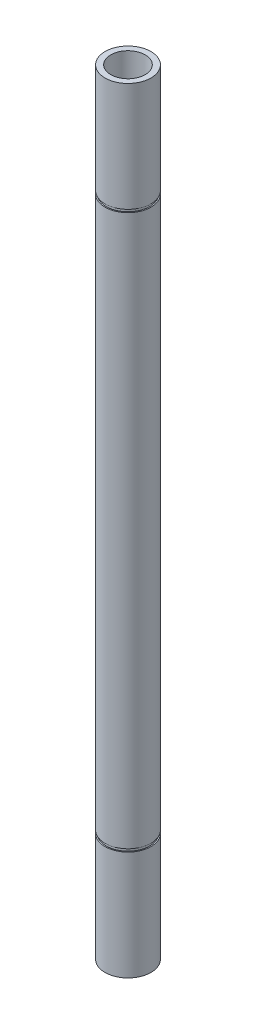
ISO-10303-21;
HEADER;
FILE_DESCRIPTION(('STEP AP214'),'2;1');
FILE_NAME('part.step','',(''),(''),'','','');
FILE_SCHEMA(('AUTOMOTIVE_DESIGN { 1 0 10303 214 1 1 1 1 }'));
ENDSEC;
DATA;
#1=APPLICATION_CONTEXT('core data for automotive mechanical design processes');
#2=APPLICATION_PROTOCOL_DEFINITION('international standard','automotive_design',2000,#1);
#3=PRODUCT_CONTEXT('',#1,'mechanical');
#4=PRODUCT('Part','Part','',(#3));
#5=PRODUCT_RELATED_PRODUCT_CATEGORY('part','',(#4));
#6=PRODUCT_DEFINITION_FORMATION('','',#4);
#7=PRODUCT_DEFINITION_CONTEXT('part definition',#1,'design');
#8=PRODUCT_DEFINITION('design','',#6,#7);
#9=PRODUCT_DEFINITION_SHAPE('','',#8);
#10=(LENGTH_UNIT() NAMED_UNIT(*) SI_UNIT(.MILLI.,.METRE.));
#11=(NAMED_UNIT(*) PLANE_ANGLE_UNIT() SI_UNIT($,.RADIAN.));
#12=(NAMED_UNIT(*) SI_UNIT($,.STERADIAN.) SOLID_ANGLE_UNIT());
#13=UNCERTAINTY_MEASURE_WITH_UNIT(LENGTH_MEASURE(1.E-05),#10,'distance_accuracy_value','');
#14=(GEOMETRIC_REPRESENTATION_CONTEXT(3) GLOBAL_UNCERTAINTY_ASSIGNED_CONTEXT((#13)) GLOBAL_UNIT_ASSIGNED_CONTEXT((#10,
#11,#12)) REPRESENTATION_CONTEXT('',''));
#15=CARTESIAN_POINT('',(0.,0.,0.));
#16=DIRECTION('',(0.,0.,1.));
#17=DIRECTION('',(1.,0.,0.));
#18=AXIS2_PLACEMENT_3D('',#15,#16,#17);
#19=CARTESIAN_POINT('',(0.,64.3022671838045,0.));
#20=DIRECTION('',(0.,1.,0.));
#21=DIRECTION('',(0.,0.,1.));
#22=AXIS2_PLACEMENT_3D('',#19,#20,#21);
#23=CYLINDRICAL_SURFACE('',#22,3.);
#24=CARTESIAN_POINT('',(0.,67.5,0.));
#25=DIRECTION('',(0.,1.,0.));
#26=DIRECTION('',(0.,0.,1.));
#27=AXIS2_PLACEMENT_3D('',#24,#25,#26);
#28=CIRCLE('',#27,3.);
#29=CARTESIAN_POINT('',(0.,67.5,3.));
#30=VERTEX_POINT('',#29);
#31=EDGE_CURVE('E94',#30,#30,#28,.T.);
#32=ORIENTED_EDGE('',*,*,#31,.T.);
#33=EDGE_LOOP('',(#32));
#34=FACE_BOUND('',#33,.T.);
#35=CARTESIAN_POINT('',(0.,-67.5,0.));
#36=DIRECTION('',(0.,1.,0.));
#37=DIRECTION('',(0.,0.,1.));
#38=AXIS2_PLACEMENT_3D('',#35,#36,#37);
#39=CIRCLE('',#38,3.);
#40=CARTESIAN_POINT('',(0.,-67.5,3.));
#41=VERTEX_POINT('',#40);
#42=EDGE_CURVE('E10',#41,#41,#39,.T.);
#43=ORIENTED_EDGE('',*,*,#42,.F.);
#44=EDGE_LOOP('',(#43));
#45=FACE_BOUND('',#44,.T.);
#46=ADVANCED_FACE('F43',(#34,#45),#23,.F.);
#47=CARTESIAN_POINT('',(-3.,-67.5,0.));
#48=DIRECTION('',(0.,-1.,0.));
#49=DIRECTION('',(0.,0.,-1.));
#50=AXIS2_PLACEMENT_3D('',#47,#48,#49);
#51=PLANE('',#50);
#52=ORIENTED_EDGE('',*,*,#42,.T.);
#53=EDGE_LOOP('',(#52));
#54=FACE_BOUND('',#53,.T.);
#55=CARTESIAN_POINT('',(0.,-67.5,0.));
#56=DIRECTION('',(0.,1.,0.));
#57=DIRECTION('',(0.,0.,1.));
#58=AXIS2_PLACEMENT_3D('',#55,#56,#57);
#59=CIRCLE('',#58,4.);
#60=CARTESIAN_POINT('',(0.,-67.5,4.));
#61=VERTEX_POINT('',#60);
#62=EDGE_CURVE('E49',#61,#61,#59,.T.);
#63=ORIENTED_EDGE('',*,*,#62,.F.);
#64=EDGE_LOOP('',(#63));
#65=FACE_BOUND('',#64,.T.);
#66=ADVANCED_FACE('F114',(#54,#65),#51,.T.);
#67=CARTESIAN_POINT('',(0.,64.3022671838045,0.));
#68=DIRECTION('',(0.,1.,0.));
#69=DIRECTION('',(0.,0.,1.));
#70=AXIS2_PLACEMENT_3D('',#67,#68,#69);
#71=CYLINDRICAL_SURFACE('',#70,4.);
#72=ORIENTED_EDGE('',*,*,#62,.T.);
#73=EDGE_LOOP('',(#72));
#74=FACE_BOUND('',#73,.T.);
#75=CARTESIAN_POINT('',(0.,-48.5,0.));
#76=DIRECTION('',(0.,1.,0.));
#77=DIRECTION('',(0.,0.,1.));
#78=AXIS2_PLACEMENT_3D('',#75,#76,#77);
#79=CIRCLE('',#78,4.);
#80=CARTESIAN_POINT('',(0.,-48.5,4.));
#81=VERTEX_POINT('',#80);
#82=EDGE_CURVE('E54',#81,#81,#79,.T.);
#83=ORIENTED_EDGE('',*,*,#82,.F.);
#84=EDGE_LOOP('',(#83));
#85=FACE_BOUND('',#84,.T.);
#86=ADVANCED_FACE('F116',(#74,#85),#71,.T.);
#87=CARTESIAN_POINT('',(-4.,-48.5,0.));
#88=DIRECTION('',(0.,1.,0.));
#89=DIRECTION('',(0.,0.,1.));
#90=AXIS2_PLACEMENT_3D('',#87,#88,#89);
#91=PLANE('',#90);
#92=ORIENTED_EDGE('',*,*,#82,.T.);
#93=EDGE_LOOP('',(#92));
#94=FACE_BOUND('',#93,.T.);
#95=CARTESIAN_POINT('',(0.,-48.5,0.));
#96=DIRECTION('',(0.,1.,0.));
#97=DIRECTION('',(0.,0.,1.));
#98=AXIS2_PLACEMENT_3D('',#95,#96,#97);
#99=CIRCLE('',#98,3.8);
#100=CARTESIAN_POINT('',(0.,-48.5,3.8));
#101=VERTEX_POINT('',#100);
#102=EDGE_CURVE('E58',#101,#101,#99,.T.);
#103=ORIENTED_EDGE('',*,*,#102,.F.);
#104=EDGE_LOOP('',(#103));
#105=FACE_BOUND('',#104,.T.);
#106=ADVANCED_FACE('F121',(#94,#105),#91,.T.);
#107=CARTESIAN_POINT('',(0.,64.3022671838045,0.));
#108=DIRECTION('',(0.,1.,0.));
#109=DIRECTION('',(0.,0.,1.));
#110=AXIS2_PLACEMENT_3D('',#107,#108,#109);
#111=CYLINDRICAL_SURFACE('',#110,3.8);
#112=ORIENTED_EDGE('',*,*,#102,.T.);
#113=EDGE_LOOP('',(#112));
#114=FACE_BOUND('',#113,.T.);
#115=CARTESIAN_POINT('',(0.,-48.,0.));
#116=DIRECTION('',(0.,1.,0.));
#117=DIRECTION('',(0.,0.,1.));
#118=AXIS2_PLACEMENT_3D('',#115,#116,#117);
#119=CIRCLE('',#118,3.8);
#120=CARTESIAN_POINT('',(0.,-48.,3.8));
#121=VERTEX_POINT('',#120);
#122=EDGE_CURVE('E66',#121,#121,#119,.T.);
#123=ORIENTED_EDGE('',*,*,#122,.F.);
#124=EDGE_LOOP('',(#123));
#125=FACE_BOUND('',#124,.T.);
#126=ADVANCED_FACE('F130',(#114,#125),#111,.T.);
#127=CARTESIAN_POINT('',(-3.8,-48.,0.));
#128=DIRECTION('',(0.,-1.,0.));
#129=DIRECTION('',(0.,0.,-1.));
#130=AXIS2_PLACEMENT_3D('',#127,#128,#129);
#131=PLANE('',#130);
#132=ORIENTED_EDGE('',*,*,#122,.T.);
#133=EDGE_LOOP('',(#132));
#134=FACE_BOUND('',#133,.T.);
#135=CARTESIAN_POINT('',(0.,-48.,0.));
#136=DIRECTION('',(0.,1.,0.));
#137=DIRECTION('',(0.,0.,1.));
#138=AXIS2_PLACEMENT_3D('',#135,#136,#137);
#139=CIRCLE('',#138,3.99999999999998);
#140=CARTESIAN_POINT('',(0.,-48.,3.99999999999998));
#141=VERTEX_POINT('',#140);
#142=EDGE_CURVE('E69',#141,#141,#139,.T.);
#143=ORIENTED_EDGE('',*,*,#142,.F.);
#144=EDGE_LOOP('',(#143));
#145=FACE_BOUND('',#144,.T.);
#146=ADVANCED_FACE('F134',(#134,#145),#131,.T.);
#147=CARTESIAN_POINT('',(0.,64.3022671838045,0.));
#148=DIRECTION('',(0.,1.,0.));
#149=DIRECTION('',(0.,0.,1.));
#150=AXIS2_PLACEMENT_3D('',#147,#148,#149);
#151=CYLINDRICAL_SURFACE('',#150,3.99999999999998);
#152=ORIENTED_EDGE('',*,*,#142,.T.);
#153=EDGE_LOOP('',(#152));
#154=FACE_BOUND('',#153,.T.);
#155=CARTESIAN_POINT('',(0.,48.,0.));
#156=DIRECTION('',(0.,1.,0.));
#157=DIRECTION('',(0.,0.,1.));
#158=AXIS2_PLACEMENT_3D('',#155,#156,#157);
#159=CIRCLE('',#158,3.99999999999998);
#160=CARTESIAN_POINT('',(0.,48.,3.99999999999998));
#161=VERTEX_POINT('',#160);
#162=EDGE_CURVE('E74',#161,#161,#159,.T.);
#163=ORIENTED_EDGE('',*,*,#162,.F.);
#164=EDGE_LOOP('',(#163));
#165=FACE_BOUND('',#164,.T.);
#166=ADVANCED_FACE('F132',(#154,#165),#151,.T.);
#167=CARTESIAN_POINT('',(-3.8,48.,0.));
#168=DIRECTION('',(0.,1.,0.));
#169=DIRECTION('',(0.,0.,1.));
#170=AXIS2_PLACEMENT_3D('',#167,#168,#169);
#171=PLANE('',#170);
#172=ORIENTED_EDGE('',*,*,#162,.T.);
#173=EDGE_LOOP('',(#172));
#174=FACE_BOUND('',#173,.T.);
#175=CARTESIAN_POINT('',(0.,48.,0.));
#176=DIRECTION('',(0.,1.,0.));
#177=DIRECTION('',(0.,0.,1.));
#178=AXIS2_PLACEMENT_3D('',#175,#176,#177);
#179=CIRCLE('',#178,3.8);
#180=CARTESIAN_POINT('',(0.,48.,3.8));
#181=VERTEX_POINT('',#180);
#182=EDGE_CURVE('E80',#181,#181,#179,.T.);
#183=ORIENTED_EDGE('',*,*,#182,.F.);
#184=EDGE_LOOP('',(#183));
#185=FACE_BOUND('',#184,.T.);
#186=ADVANCED_FACE('F138',(#174,#185),#171,.T.);
#187=CARTESIAN_POINT('',(0.,64.3022671838045,0.));
#188=DIRECTION('',(0.,1.,0.));
#189=DIRECTION('',(0.,0.,1.));
#190=AXIS2_PLACEMENT_3D('',#187,#188,#189);
#191=CYLINDRICAL_SURFACE('',#190,3.8);
#192=ORIENTED_EDGE('',*,*,#182,.T.);
#193=EDGE_LOOP('',(#192));
#194=FACE_BOUND('',#193,.T.);
#195=CARTESIAN_POINT('',(0.,48.5,0.));
#196=DIRECTION('',(0.,1.,0.));
#197=DIRECTION('',(0.,0.,1.));
#198=AXIS2_PLACEMENT_3D('',#195,#196,#197);
#199=CIRCLE('',#198,3.8);
#200=CARTESIAN_POINT('',(0.,48.5,3.8));
#201=VERTEX_POINT('',#200);
#202=EDGE_CURVE('E85',#201,#201,#199,.T.);
#203=ORIENTED_EDGE('',*,*,#202,.F.);
#204=EDGE_LOOP('',(#203));
#205=FACE_BOUND('',#204,.T.);
#206=ADVANCED_FACE('F141',(#194,#205),#191,.T.);
#207=CARTESIAN_POINT('',(-4.,48.5,0.));
#208=DIRECTION('',(0.,-1.,0.));
#209=DIRECTION('',(0.,0.,-1.));
#210=AXIS2_PLACEMENT_3D('',#207,#208,#209);
#211=PLANE('',#210);
#212=ORIENTED_EDGE('',*,*,#202,.T.);
#213=EDGE_LOOP('',(#212));
#214=FACE_BOUND('',#213,.T.);
#215=CARTESIAN_POINT('',(0.,48.5,0.));
#216=DIRECTION('',(0.,1.,0.));
#217=DIRECTION('',(0.,0.,1.));
#218=AXIS2_PLACEMENT_3D('',#215,#216,#217);
#219=CIRCLE('',#218,4.);
#220=CARTESIAN_POINT('',(0.,48.5,4.));
#221=VERTEX_POINT('',#220);
#222=EDGE_CURVE('E88',#221,#221,#219,.T.);
#223=ORIENTED_EDGE('',*,*,#222,.F.);
#224=EDGE_LOOP('',(#223));
#225=FACE_BOUND('',#224,.T.);
#226=ADVANCED_FACE('F108',(#214,#225),#211,.T.);
#227=CARTESIAN_POINT('',(0.,64.3022671838045,0.));
#228=DIRECTION('',(0.,1.,0.));
#229=DIRECTION('',(0.,0.,1.));
#230=AXIS2_PLACEMENT_3D('',#227,#228,#229);
#231=CYLINDRICAL_SURFACE('',#230,4.);
#232=ORIENTED_EDGE('',*,*,#222,.T.);
#233=EDGE_LOOP('',(#232));
#234=FACE_BOUND('',#233,.T.);
#235=CARTESIAN_POINT('',(0.,67.5,0.));
#236=DIRECTION('',(0.,1.,0.));
#237=DIRECTION('',(0.,0.,1.));
#238=AXIS2_PLACEMENT_3D('',#235,#236,#237);
#239=CIRCLE('',#238,4.);
#240=CARTESIAN_POINT('',(0.,67.5,4.));
#241=VERTEX_POINT('',#240);
#242=EDGE_CURVE('E89',#241,#241,#239,.T.);
#243=ORIENTED_EDGE('',*,*,#242,.F.);
#244=EDGE_LOOP('',(#243));
#245=FACE_BOUND('',#244,.T.);
#246=ADVANCED_FACE('F103',(#234,#245),#231,.T.);
#247=CARTESIAN_POINT('',(-3.,67.5,0.));
#248=DIRECTION('',(0.,1.,0.));
#249=DIRECTION('',(0.,0.,1.));
#250=AXIS2_PLACEMENT_3D('',#247,#248,#249);
#251=PLANE('',#250);
#252=ORIENTED_EDGE('',*,*,#242,.T.);
#253=EDGE_LOOP('',(#252));
#254=FACE_BOUND('',#253,.T.);
#255=ORIENTED_EDGE('',*,*,#31,.F.);
#256=EDGE_LOOP('',(#255));
#257=FACE_BOUND('',#256,.T.);
#258=ADVANCED_FACE('F101',(#254,#257),#251,.T.);
#259=CLOSED_SHELL('',(#46,#66,#86,#106,#126,#146,#166,#186,#206,#226,#246,#258));
#260=MANIFOLD_SOLID_BREP('B2',#259);
#261=ADVANCED_BREP_SHAPE_REPRESENTATION('',(#18,#260),#14);
#262=SHAPE_DEFINITION_REPRESENTATION(#9,#261);
ENDSEC;
END-ISO-10303-21;
